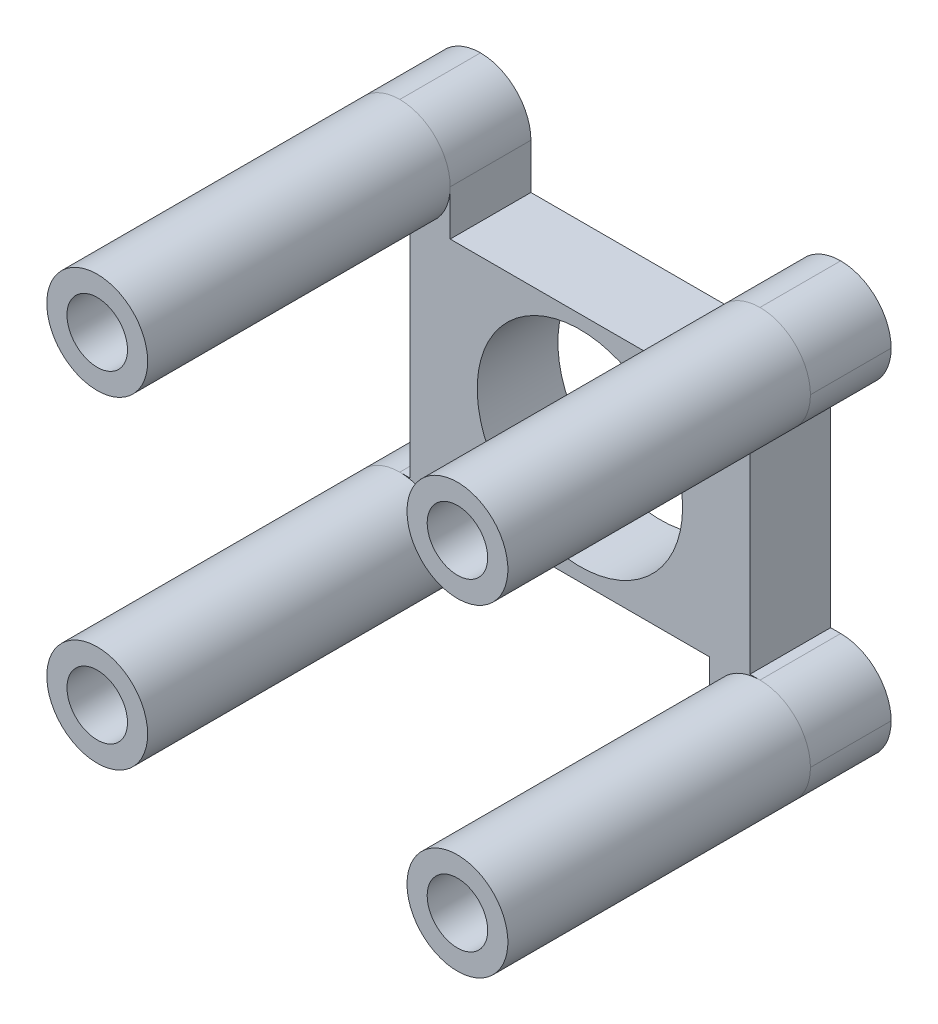
ISO-10303-21;
HEADER;
FILE_DESCRIPTION(('STEP AP214'),'2;1');
FILE_NAME('part.step','',(''),(''),'','','');
FILE_SCHEMA(('AUTOMOTIVE_DESIGN { 1 0 10303 214 1 1 1 1 }'));
ENDSEC;
DATA;
#1=APPLICATION_CONTEXT('core data for automotive mechanical design processes');
#2=APPLICATION_PROTOCOL_DEFINITION('international standard','automotive_design',2000,#1);
#3=PRODUCT_CONTEXT('',#1,'mechanical');
#4=PRODUCT('Part','Part','',(#3));
#5=PRODUCT_RELATED_PRODUCT_CATEGORY('part','',(#4));
#6=PRODUCT_DEFINITION_FORMATION('','',#4);
#7=PRODUCT_DEFINITION_CONTEXT('part definition',#1,'design');
#8=PRODUCT_DEFINITION('design','',#6,#7);
#9=PRODUCT_DEFINITION_SHAPE('','',#8);
#10=(LENGTH_UNIT() NAMED_UNIT(*) SI_UNIT(.MILLI.,.METRE.));
#11=(NAMED_UNIT(*) PLANE_ANGLE_UNIT() SI_UNIT($,.RADIAN.));
#12=(NAMED_UNIT(*) SI_UNIT($,.STERADIAN.) SOLID_ANGLE_UNIT());
#13=UNCERTAINTY_MEASURE_WITH_UNIT(LENGTH_MEASURE(1.E-05),#10,'distance_accuracy_value','');
#14=(GEOMETRIC_REPRESENTATION_CONTEXT(3) GLOBAL_UNCERTAINTY_ASSIGNED_CONTEXT((#13)) GLOBAL_UNIT_ASSIGNED_CONTEXT((#10,
#11,#12)) REPRESENTATION_CONTEXT('',''));
#15=CARTESIAN_POINT('',(0.,0.,0.));
#16=DIRECTION('',(0.,0.,1.));
#17=DIRECTION('',(1.,0.,0.));
#18=AXIS2_PLACEMENT_3D('',#15,#16,#17);
#19=CARTESIAN_POINT('',(0.,0.,4.));
#20=DIRECTION('',(0.,0.,1.));
#21=DIRECTION('',(1.,0.,0.));
#22=AXIS2_PLACEMENT_3D('',#19,#20,#21);
#23=PLANE('',#22);
#24=CARTESIAN_POINT('',(0.,0.,4.));
#25=DIRECTION('',(0.,0.,1.));
#26=DIRECTION('',(1.,0.,0.));
#27=AXIS2_PLACEMENT_3D('',#24,#25,#26);
#28=CIRCLE('',#27,5.09089278078686);
#29=CARTESIAN_POINT('',(5.09089278078686,0.,4.));
#30=VERTEX_POINT('',#29);
#31=EDGE_CURVE('E302',#30,#30,#28,.T.);
#32=ORIENTED_EDGE('',*,*,#31,.F.);
#33=EDGE_LOOP('',(#32));
#34=FACE_BOUND('',#33,.T.);
#35=CARTESIAN_POINT('',(8.92857817851206,-8.,4.));
#36=DIRECTION('',(0.,0.,1.));
#37=DIRECTION('',(1.,0.,0.));
#38=AXIS2_PLACEMENT_3D('',#35,#36,#37);
#39=CIRCLE('',#38,2.5);
#40=CARTESIAN_POINT('',(6.42857817851206,-8.,4.));
#41=VERTEX_POINT('',#40);
#42=CARTESIAN_POINT('',(8.92857817851206,-5.5,4.));
#43=VERTEX_POINT('',#42);
#44=EDGE_CURVE('E339',#41,#43,#39,.F.);
#45=ORIENTED_EDGE('',*,*,#44,.T.);
#46=DIRECTION('',(-1.,0.,0.));
#47=VECTOR('',#46,1.);
#48=CARTESIAN_POINT('',(11.4285781785121,-5.5,4.));
#49=LINE('',#48,#47);
#50=CARTESIAN_POINT('',(8.42857817851206,-5.5,4.));
#51=VERTEX_POINT('',#50);
#52=EDGE_CURVE('E218',#43,#51,#49,.T.);
#53=ORIENTED_EDGE('',*,*,#52,.T.);
#54=DIRECTION('',(0.,1.,0.));
#55=VECTOR('',#54,1.);
#56=CARTESIAN_POINT('',(8.42857817851206,5.5,4.));
#57=LINE('',#56,#55);
#58=CARTESIAN_POINT('',(8.42857817851206,5.5,4.));
#59=VERTEX_POINT('',#58);
#60=EDGE_CURVE('E206',#51,#59,#57,.T.);
#61=ORIENTED_EDGE('',*,*,#60,.T.);
#62=DIRECTION('',(1.,0.,0.));
#63=VECTOR('',#62,1.);
#64=CARTESIAN_POINT('',(11.4285781785121,5.5,4.));
#65=LINE('',#64,#63);
#66=CARTESIAN_POINT('',(8.92857817851206,5.5,4.));
#67=VERTEX_POINT('',#66);
#68=EDGE_CURVE('E199',#59,#67,#65,.T.);
#69=ORIENTED_EDGE('',*,*,#68,.T.);
#70=CARTESIAN_POINT('',(8.92857817851206,8.,4.));
#71=DIRECTION('',(0.,0.,1.));
#72=DIRECTION('',(1.,0.,0.));
#73=AXIS2_PLACEMENT_3D('',#70,#71,#72);
#74=CIRCLE('',#73,2.5);
#75=CARTESIAN_POINT('',(6.42857817851205,8.,4.));
#76=VERTEX_POINT('',#75);
#77=EDGE_CURVE('E330',#76,#67,#74,.T.);
#78=ORIENTED_EDGE('',*,*,#77,.F.);
#79=DIRECTION('',(0.,-1.,0.));
#80=VECTOR('',#79,1.);
#81=CARTESIAN_POINT('',(6.42857817851205,0.,4.));
#82=LINE('',#81,#80);
#83=CARTESIAN_POINT('',(6.42857817851205,5.75536104650486,4.));
#84=VERTEX_POINT('',#83);
#85=EDGE_CURVE('E298',#76,#84,#82,.T.);
#86=ORIENTED_EDGE('',*,*,#85,.T.);
#87=DIRECTION('',(1.,0.,0.));
#88=VECTOR('',#87,1.);
#89=CARTESIAN_POINT('',(0.,5.75536104650486,4.));
#90=LINE('',#89,#88);
#91=CARTESIAN_POINT('',(-6.42857817851206,5.75536104650486,4.));
#92=VERTEX_POINT('',#91);
#93=EDGE_CURVE('E299',#92,#84,#90,.T.);
#94=ORIENTED_EDGE('',*,*,#93,.F.);
#95=DIRECTION('',(0.,-1.,0.));
#96=VECTOR('',#95,1.);
#97=CARTESIAN_POINT('',(-6.42857817851206,0.,4.));
#98=LINE('',#97,#96);
#99=CARTESIAN_POINT('',(-6.42857817851206,8.,4.));
#100=VERTEX_POINT('',#99);
#101=EDGE_CURVE('E293',#100,#92,#98,.T.);
#102=ORIENTED_EDGE('',*,*,#101,.F.);
#103=CARTESIAN_POINT('',(-8.92857817851206,8.,4.));
#104=DIRECTION('',(0.,0.,1.));
#105=DIRECTION('',(1.,0.,0.));
#106=AXIS2_PLACEMENT_3D('',#103,#104,#105);
#107=CIRCLE('',#106,2.5);
#108=CARTESIAN_POINT('',(-8.92857817851206,5.5,4.));
#109=VERTEX_POINT('',#108);
#110=EDGE_CURVE('E287',#109,#100,#107,.T.);
#111=ORIENTED_EDGE('',*,*,#110,.F.);
#112=DIRECTION('',(-1.,0.,0.));
#113=VECTOR('',#112,1.);
#114=CARTESIAN_POINT('',(-11.4285781785121,5.5,4.));
#115=LINE('',#114,#113);
#116=CARTESIAN_POINT('',(-8.42857817851206,5.5,4.));
#117=VERTEX_POINT('',#116);
#118=EDGE_CURVE('E231',#117,#109,#115,.T.);
#119=ORIENTED_EDGE('',*,*,#118,.F.);
#120=DIRECTION('',(0.,1.,0.));
#121=VECTOR('',#120,1.);
#122=CARTESIAN_POINT('',(-8.42857817851206,5.5,4.));
#123=LINE('',#122,#121);
#124=CARTESIAN_POINT('',(-8.42857817851206,-5.5,4.));
#125=VERTEX_POINT('',#124);
#126=EDGE_CURVE('E228',#125,#117,#123,.T.);
#127=ORIENTED_EDGE('',*,*,#126,.F.);
#128=DIRECTION('',(1.,0.,0.));
#129=VECTOR('',#128,1.);
#130=CARTESIAN_POINT('',(-11.4285781785121,-5.5,4.));
#131=LINE('',#130,#129);
#132=CARTESIAN_POINT('',(-8.92857817851206,-5.5,4.));
#133=VERTEX_POINT('',#132);
#134=EDGE_CURVE('E226',#133,#125,#131,.T.);
#135=ORIENTED_EDGE('',*,*,#134,.F.);
#136=CARTESIAN_POINT('',(-8.92857817851206,-8.,4.));
#137=DIRECTION('',(0.,0.,1.));
#138=DIRECTION('',(1.,0.,0.));
#139=AXIS2_PLACEMENT_3D('',#136,#137,#138);
#140=CIRCLE('',#139,2.5);
#141=CARTESIAN_POINT('',(-6.42857817851206,-8.,4.));
#142=VERTEX_POINT('',#141);
#143=EDGE_CURVE('E343',#142,#133,#140,.T.);
#144=ORIENTED_EDGE('',*,*,#143,.F.);
#145=CARTESIAN_POINT('',(-6.42857817851206,-5.75536104650486,4.));
#146=VERTEX_POINT('',#145);
#147=EDGE_CURVE('E289',#146,#142,#98,.T.);
#148=ORIENTED_EDGE('',*,*,#147,.F.);
#149=DIRECTION('',(1.,0.,0.));
#150=VECTOR('',#149,1.);
#151=CARTESIAN_POINT('',(0.,-5.75536104650486,4.));
#152=LINE('',#151,#150);
#153=CARTESIAN_POINT('',(6.42857817851205,-5.75536104650486,4.));
#154=VERTEX_POINT('',#153);
#155=EDGE_CURVE('E291',#146,#154,#152,.T.);
#156=ORIENTED_EDGE('',*,*,#155,.T.);
#157=EDGE_CURVE('E295',#154,#41,#82,.T.);
#158=ORIENTED_EDGE('',*,*,#157,.T.);
#159=EDGE_LOOP('',(#45,#53,#61,#69,#78,#86,#94,#102,#111,#119,#127,#135,#144,#148,#156,#158));
#160=FACE_BOUND('',#159,.T.);
#161=ADVANCED_FACE('F35',(#34,#160),#23,.T.);
#162=CARTESIAN_POINT('',(0.,0.,0.));
#163=DIRECTION('',(0.,0.,1.));
#164=DIRECTION('',(1.,0.,0.));
#165=AXIS2_PLACEMENT_3D('',#162,#163,#164);
#166=PLANE('',#165);
#167=CARTESIAN_POINT('',(0.,0.,0.));
#168=DIRECTION('',(0.,0.,1.));
#169=DIRECTION('',(1.,0.,0.));
#170=AXIS2_PLACEMENT_3D('',#167,#168,#169);
#171=CIRCLE('',#170,5.09089278078686);
#172=CARTESIAN_POINT('',(5.09089278078686,0.,0.));
#173=VERTEX_POINT('',#172);
#174=EDGE_CURVE('E292',#173,#173,#171,.T.);
#175=ORIENTED_EDGE('',*,*,#174,.T.);
#176=EDGE_LOOP('',(#175));
#177=FACE_BOUND('',#176,.T.);
#178=CARTESIAN_POINT('',(-8.92857817851206,-8.,0.));
#179=DIRECTION('',(0.,0.,1.));
#180=DIRECTION('',(1.,0.,0.));
#181=AXIS2_PLACEMENT_3D('',#178,#179,#180);
#182=CIRCLE('',#181,2.5);
#183=CARTESIAN_POINT('',(-8.92857817851206,-10.5,0.));
#184=VERTEX_POINT('',#183);
#185=CARTESIAN_POINT('',(-11.4285781785121,-8.,0.));
#186=VERTEX_POINT('',#185);
#187=EDGE_CURVE('E362',#184,#186,#182,.F.);
#188=ORIENTED_EDGE('',*,*,#187,.T.);
#189=CARTESIAN_POINT('',(-8.92857817851206,-8.,0.));
#190=DIRECTION('',(0.,0.,1.));
#191=DIRECTION('',(1.,0.,0.));
#192=AXIS2_PLACEMENT_3D('',#189,#190,#191);
#193=CIRCLE('',#192,2.5);
#194=CARTESIAN_POINT('',(-8.92857817851206,-5.5,0.));
#195=VERTEX_POINT('',#194);
#196=EDGE_CURVE('E406',#186,#195,#193,.F.);
#197=ORIENTED_EDGE('',*,*,#196,.T.);
#198=DIRECTION('',(-1.,0.,0.));
#199=VECTOR('',#198,1.);
#200=CARTESIAN_POINT('',(-11.4285781785121,-5.5,0.));
#201=LINE('',#200,#199);
#202=CARTESIAN_POINT('',(-8.42857817851206,-5.5,0.));
#203=VERTEX_POINT('',#202);
#204=EDGE_CURVE('E236',#203,#195,#201,.T.);
#205=ORIENTED_EDGE('',*,*,#204,.F.);
#206=DIRECTION('',(0.,-1.,0.));
#207=VECTOR('',#206,1.);
#208=CARTESIAN_POINT('',(-8.42857817851206,5.5,0.));
#209=LINE('',#208,#207);
#210=CARTESIAN_POINT('',(-8.42857817851206,5.5,0.));
#211=VERTEX_POINT('',#210);
#212=EDGE_CURVE('E222',#211,#203,#209,.T.);
#213=ORIENTED_EDGE('',*,*,#212,.F.);
#214=DIRECTION('',(1.,0.,0.));
#215=VECTOR('',#214,1.);
#216=CARTESIAN_POINT('',(-11.4285781785121,5.5,0.));
#217=LINE('',#216,#215);
#218=CARTESIAN_POINT('',(-8.92857817851206,5.5,0.));
#219=VERTEX_POINT('',#218);
#220=EDGE_CURVE('E224',#219,#211,#217,.T.);
#221=ORIENTED_EDGE('',*,*,#220,.F.);
#222=CARTESIAN_POINT('',(-8.92857817851206,8.,0.));
#223=DIRECTION('',(0.,0.,1.));
#224=DIRECTION('',(1.,0.,0.));
#225=AXIS2_PLACEMENT_3D('',#222,#223,#224);
#226=CIRCLE('',#225,2.5);
#227=CARTESIAN_POINT('',(-11.4285781785121,8.,0.));
#228=VERTEX_POINT('',#227);
#229=EDGE_CURVE('E398',#219,#228,#226,.F.);
#230=ORIENTED_EDGE('',*,*,#229,.T.);
#231=CARTESIAN_POINT('',(-8.92857817851206,8.,0.));
#232=DIRECTION('',(0.,0.,1.));
#233=DIRECTION('',(1.,0.,0.));
#234=AXIS2_PLACEMENT_3D('',#231,#232,#233);
#235=CIRCLE('',#234,2.5);
#236=CARTESIAN_POINT('',(-8.92857817851206,10.5,0.));
#237=VERTEX_POINT('',#236);
#238=EDGE_CURVE('E346',#228,#237,#235,.F.);
#239=ORIENTED_EDGE('',*,*,#238,.T.);
#240=CARTESIAN_POINT('',(-8.92857817851206,8.,0.));
#241=DIRECTION('',(0.,0.,1.));
#242=DIRECTION('',(1.,0.,0.));
#243=AXIS2_PLACEMENT_3D('',#240,#241,#242);
#244=CIRCLE('',#243,2.5);
#245=CARTESIAN_POINT('',(-6.42857817851206,8.,0.));
#246=VERTEX_POINT('',#245);
#247=EDGE_CURVE('E350',#237,#246,#244,.F.);
#248=ORIENTED_EDGE('',*,*,#247,.T.);
#249=DIRECTION('',(0.,-1.,0.));
#250=VECTOR('',#249,1.);
#251=CARTESIAN_POINT('',(-6.42857817851206,0.,0.));
#252=LINE('',#251,#250);
#253=CARTESIAN_POINT('',(-6.42857817851206,5.75536104650486,0.));
#254=VERTEX_POINT('',#253);
#255=EDGE_CURVE('E309',#246,#254,#252,.T.);
#256=ORIENTED_EDGE('',*,*,#255,.T.);
#257=DIRECTION('',(1.,0.,0.));
#258=VECTOR('',#257,1.);
#259=CARTESIAN_POINT('',(0.,5.75536104650486,0.));
#260=LINE('',#259,#258);
#261=CARTESIAN_POINT('',(6.42857817851205,5.75536104650486,0.));
#262=VERTEX_POINT('',#261);
#263=EDGE_CURVE('E315',#254,#262,#260,.T.);
#264=ORIENTED_EDGE('',*,*,#263,.T.);
#265=DIRECTION('',(0.,-1.,0.));
#266=VECTOR('',#265,1.);
#267=CARTESIAN_POINT('',(6.42857817851205,0.,0.));
#268=LINE('',#267,#266);
#269=CARTESIAN_POINT('',(6.42857817851205,8.,0.));
#270=VERTEX_POINT('',#269);
#271=EDGE_CURVE('E314',#270,#262,#268,.T.);
#272=ORIENTED_EDGE('',*,*,#271,.F.);
#273=CARTESIAN_POINT('',(8.92857817851205,8.,0.));
#274=DIRECTION('',(0.,0.,1.));
#275=DIRECTION('',(1.,0.,0.));
#276=AXIS2_PLACEMENT_3D('',#273,#274,#275);
#277=CIRCLE('',#276,2.5);
#278=CARTESIAN_POINT('',(8.92857817851205,10.5,0.));
#279=VERTEX_POINT('',#278);
#280=EDGE_CURVE('E352',#270,#279,#277,.F.);
#281=ORIENTED_EDGE('',*,*,#280,.T.);
#282=CARTESIAN_POINT('',(8.92857817851205,8.,0.));
#283=DIRECTION('',(0.,0.,1.));
#284=DIRECTION('',(1.,0.,0.));
#285=AXIS2_PLACEMENT_3D('',#282,#283,#284);
#286=CIRCLE('',#285,2.5);
#287=CARTESIAN_POINT('',(11.4285781785121,8.,0.));
#288=VERTEX_POINT('',#287);
#289=EDGE_CURVE('E354',#279,#288,#286,.F.);
#290=ORIENTED_EDGE('',*,*,#289,.T.);
#291=CARTESIAN_POINT('',(8.92857817851205,8.,0.));
#292=DIRECTION('',(0.,0.,1.));
#293=DIRECTION('',(1.,0.,0.));
#294=AXIS2_PLACEMENT_3D('',#291,#292,#293);
#295=CIRCLE('',#294,2.5);
#296=CARTESIAN_POINT('',(8.92857817851205,5.5,0.));
#297=VERTEX_POINT('',#296);
#298=EDGE_CURVE('E50',#288,#297,#295,.F.);
#299=ORIENTED_EDGE('',*,*,#298,.T.);
#300=DIRECTION('',(-1.,0.,0.));
#301=VECTOR('',#300,1.);
#302=CARTESIAN_POINT('',(11.4285781785121,5.5,0.));
#303=LINE('',#302,#301);
#304=CARTESIAN_POINT('',(8.42857817851206,5.5,0.));
#305=VERTEX_POINT('',#304);
#306=EDGE_CURVE('E208',#297,#305,#303,.T.);
#307=ORIENTED_EDGE('',*,*,#306,.T.);
#308=DIRECTION('',(0.,-1.,0.));
#309=VECTOR('',#308,1.);
#310=CARTESIAN_POINT('',(8.42857817851206,5.5,0.));
#311=LINE('',#310,#309);
#312=CARTESIAN_POINT('',(8.42857817851206,-5.5,0.));
#313=VERTEX_POINT('',#312);
#314=EDGE_CURVE('E200',#305,#313,#311,.T.);
#315=ORIENTED_EDGE('',*,*,#314,.T.);
#316=DIRECTION('',(1.,0.,0.));
#317=VECTOR('',#316,1.);
#318=CARTESIAN_POINT('',(11.4285781785121,-5.5,0.));
#319=LINE('',#318,#317);
#320=CARTESIAN_POINT('',(8.92857817851206,-5.5,0.));
#321=VERTEX_POINT('',#320);
#322=EDGE_CURVE('E192',#313,#321,#319,.T.);
#323=ORIENTED_EDGE('',*,*,#322,.T.);
#324=CARTESIAN_POINT('',(8.92857817851206,-8.,0.));
#325=DIRECTION('',(0.,0.,1.));
#326=DIRECTION('',(1.,0.,0.));
#327=AXIS2_PLACEMENT_3D('',#324,#325,#326);
#328=CIRCLE('',#327,2.5);
#329=CARTESIAN_POINT('',(11.4285781785121,-8.,0.));
#330=VERTEX_POINT('',#329);
#331=EDGE_CURVE('E404',#321,#330,#328,.F.);
#332=ORIENTED_EDGE('',*,*,#331,.T.);
#333=CARTESIAN_POINT('',(8.92857817851206,-8.,0.));
#334=DIRECTION('',(0.,0.,1.));
#335=DIRECTION('',(1.,0.,0.));
#336=AXIS2_PLACEMENT_3D('',#333,#334,#335);
#337=CIRCLE('',#336,2.5);
#338=CARTESIAN_POINT('',(8.92857817851206,-10.5,0.));
#339=VERTEX_POINT('',#338);
#340=EDGE_CURVE('E356',#330,#339,#337,.F.);
#341=ORIENTED_EDGE('',*,*,#340,.T.);
#342=CARTESIAN_POINT('',(8.92857817851205,-8.,0.));
#343=DIRECTION('',(0.,0.,1.));
#344=DIRECTION('',(1.,0.,0.));
#345=AXIS2_PLACEMENT_3D('',#342,#343,#344);
#346=CIRCLE('',#345,2.5);
#347=CARTESIAN_POINT('',(6.42857817851205,-8.,0.));
#348=VERTEX_POINT('',#347);
#349=EDGE_CURVE('E358',#339,#348,#346,.F.);
#350=ORIENTED_EDGE('',*,*,#349,.T.);
#351=CARTESIAN_POINT('',(6.42857817851205,-5.75536104650486,0.));
#352=VERTEX_POINT('',#351);
#353=EDGE_CURVE('E311',#352,#348,#268,.T.);
#354=ORIENTED_EDGE('',*,*,#353,.F.);
#355=DIRECTION('',(1.,0.,0.));
#356=VECTOR('',#355,1.);
#357=CARTESIAN_POINT('',(0.,-5.75536104650486,0.));
#358=LINE('',#357,#356);
#359=CARTESIAN_POINT('',(-6.42857817851206,-5.75536104650486,0.));
#360=VERTEX_POINT('',#359);
#361=EDGE_CURVE('E308',#360,#352,#358,.T.);
#362=ORIENTED_EDGE('',*,*,#361,.F.);
#363=CARTESIAN_POINT('',(-6.42857817851206,-8.,0.));
#364=VERTEX_POINT('',#363);
#365=EDGE_CURVE('E285',#360,#364,#252,.T.);
#366=ORIENTED_EDGE('',*,*,#365,.T.);
#367=CARTESIAN_POINT('',(-8.92857817851206,-8.,0.));
#368=DIRECTION('',(0.,0.,1.));
#369=DIRECTION('',(1.,0.,0.));
#370=AXIS2_PLACEMENT_3D('',#367,#368,#369);
#371=CIRCLE('',#370,2.5);
#372=EDGE_CURVE('E360',#364,#184,#371,.F.);
#373=ORIENTED_EDGE('',*,*,#372,.T.);
#374=EDGE_LOOP('',(#188,#197,#205,#213,#221,#230,#239,#248,#256,#264,#272,#281,#290,#299,#307,
#315,#323,#332,#341,#350,#354,#362,#366,#373));
#375=FACE_BOUND('',#374,.T.);
#376=ADVANCED_FACE('F211',(#177,#375),#166,.F.);
#377=CARTESIAN_POINT('',(-6.42857817851206,0.,4.));
#378=DIRECTION('',(1.,0.,0.));
#379=DIRECTION('',(0.,0.,-1.));
#380=AXIS2_PLACEMENT_3D('',#377,#378,#379);
#381=PLANE('',#380);
#382=ORIENTED_EDGE('',*,*,#147,.T.);
#383=DIRECTION('',(0.,0.,-1.));
#384=VECTOR('',#383,1.);
#385=CARTESIAN_POINT('',(-6.42857817851206,-8.,4.));
#386=LINE('',#385,#384);
#387=EDGE_CURVE('E370',#142,#364,#386,.T.);
#388=ORIENTED_EDGE('',*,*,#387,.T.);
#389=ORIENTED_EDGE('',*,*,#365,.F.);
#390=DIRECTION('',(0.,0.,-1.));
#391=VECTOR('',#390,1.);
#392=CARTESIAN_POINT('',(-6.42857817851206,-5.75536104650486,4.));
#393=LINE('',#392,#391);
#394=EDGE_CURVE('E328',#146,#360,#393,.T.);
#395=ORIENTED_EDGE('',*,*,#394,.F.);
#396=EDGE_LOOP('',(#382,#388,#389,#395));
#397=FACE_BOUND('',#396,.T.);
#398=ADVANCED_FACE('F466',(#397),#381,.T.);
#399=CARTESIAN_POINT('',(0.,-5.75536104650486,4.));
#400=DIRECTION('',(0.,1.,0.));
#401=DIRECTION('',(0.,0.,1.));
#402=AXIS2_PLACEMENT_3D('',#399,#400,#401);
#403=PLANE('',#402);
#404=ORIENTED_EDGE('',*,*,#361,.T.);
#405=DIRECTION('',(0.,0.,-1.));
#406=VECTOR('',#405,1.);
#407=CARTESIAN_POINT('',(6.42857817851205,-5.75536104650486,4.));
#408=LINE('',#407,#406);
#409=EDGE_CURVE('E325',#154,#352,#408,.T.);
#410=ORIENTED_EDGE('',*,*,#409,.F.);
#411=ORIENTED_EDGE('',*,*,#155,.F.);
#412=ORIENTED_EDGE('',*,*,#394,.T.);
#413=EDGE_LOOP('',(#404,#410,#411,#412));
#414=FACE_BOUND('',#413,.T.);
#415=ADVANCED_FACE('F586',(#414),#403,.F.);
#416=CARTESIAN_POINT('',(6.42857817851205,0.,4.));
#417=DIRECTION('',(1.,0.,0.));
#418=DIRECTION('',(0.,0.,-1.));
#419=AXIS2_PLACEMENT_3D('',#416,#417,#418);
#420=PLANE('',#419);
#421=ORIENTED_EDGE('',*,*,#353,.T.);
#422=DIRECTION('',(0.,0.,-1.));
#423=VECTOR('',#422,1.);
#424=CARTESIAN_POINT('',(6.42857817851205,-8.,4.));
#425=LINE('',#424,#423);
#426=EDGE_CURVE('E372',#348,#41,#425,.F.);
#427=ORIENTED_EDGE('',*,*,#426,.T.);
#428=ORIENTED_EDGE('',*,*,#157,.F.);
#429=ORIENTED_EDGE('',*,*,#409,.T.);
#430=EDGE_LOOP('',(#421,#427,#428,#429));
#431=FACE_BOUND('',#430,.T.);
#432=ADVANCED_FACE('F441',(#431),#420,.F.);
#433=ORIENTED_EDGE('',*,*,#85,.F.);
#434=DIRECTION('',(0.,0.,-1.));
#435=VECTOR('',#434,1.);
#436=CARTESIAN_POINT('',(6.42857817851205,8.,0.));
#437=LINE('',#436,#435);
#438=EDGE_CURVE('E381',#76,#270,#437,.T.);
#439=ORIENTED_EDGE('',*,*,#438,.T.);
#440=ORIENTED_EDGE('',*,*,#271,.T.);
#441=DIRECTION('',(0.,0.,-1.));
#442=VECTOR('',#441,1.);
#443=CARTESIAN_POINT('',(6.42857817851205,5.75536104650486,4.));
#444=LINE('',#443,#442);
#445=EDGE_CURVE('E322',#84,#262,#444,.T.);
#446=ORIENTED_EDGE('',*,*,#445,.F.);
#447=EDGE_LOOP('',(#433,#439,#440,#446));
#448=FACE_BOUND('',#447,.T.);
#449=ADVANCED_FACE('F602',(#448),#420,.F.);
#450=CARTESIAN_POINT('',(0.,5.75536104650486,4.));
#451=DIRECTION('',(0.,1.,0.));
#452=DIRECTION('',(0.,0.,1.));
#453=AXIS2_PLACEMENT_3D('',#450,#451,#452);
#454=PLANE('',#453);
#455=ORIENTED_EDGE('',*,*,#263,.F.);
#456=DIRECTION('',(0.,0.,-1.));
#457=VECTOR('',#456,1.);
#458=CARTESIAN_POINT('',(-6.42857817851206,5.75536104650486,4.));
#459=LINE('',#458,#457);
#460=EDGE_CURVE('E305',#92,#254,#459,.T.);
#461=ORIENTED_EDGE('',*,*,#460,.F.);
#462=ORIENTED_EDGE('',*,*,#93,.T.);
#463=ORIENTED_EDGE('',*,*,#445,.T.);
#464=EDGE_LOOP('',(#455,#461,#462,#463));
#465=FACE_BOUND('',#464,.T.);
#466=ADVANCED_FACE('F563',(#465),#454,.T.);
#467=ORIENTED_EDGE('',*,*,#255,.F.);
#468=DIRECTION('',(0.,0.,-1.));
#469=VECTOR('',#468,1.);
#470=CARTESIAN_POINT('',(-6.42857817851206,8.,4.));
#471=LINE('',#470,#469);
#472=EDGE_CURVE('E383',#246,#100,#471,.F.);
#473=ORIENTED_EDGE('',*,*,#472,.T.);
#474=ORIENTED_EDGE('',*,*,#101,.T.);
#475=ORIENTED_EDGE('',*,*,#460,.T.);
#476=EDGE_LOOP('',(#467,#473,#474,#475));
#477=FACE_BOUND('',#476,.T.);
#478=ADVANCED_FACE('F557',(#477),#381,.T.);
#479=CARTESIAN_POINT('',(0.,0.,4.));
#480=DIRECTION('',(0.,0.,-1.));
#481=DIRECTION('',(-1.,0.,0.));
#482=AXIS2_PLACEMENT_3D('',#479,#480,#481);
#483=CYLINDRICAL_SURFACE('',#482,5.09089278078686);
#484=ORIENTED_EDGE('',*,*,#31,.T.);
#485=EDGE_LOOP('',(#484));
#486=FACE_BOUND('',#485,.T.);
#487=ORIENTED_EDGE('',*,*,#174,.F.);
#488=EDGE_LOOP('',(#487));
#489=FACE_BOUND('',#488,.T.);
#490=ADVANCED_FACE('F532',(#486,#489),#483,.F.);
#491=CARTESIAN_POINT('',(-8.92857817851206,8.,19.));
#492=DIRECTION('',(0.,0.,1.));
#493=DIRECTION('',(1.,0.,0.));
#494=AXIS2_PLACEMENT_3D('',#491,#492,#493);
#495=PLANE('',#494);
#496=CARTESIAN_POINT('',(-8.92857817851206,8.,19.));
#497=DIRECTION('',(0.,0.,1.));
#498=DIRECTION('',(1.,0.,0.));
#499=AXIS2_PLACEMENT_3D('',#496,#497,#498);
#500=CIRCLE('',#499,2.5);
#501=CARTESIAN_POINT('',(-6.42857817851206,8.,19.));
#502=VERTEX_POINT('',#501);
#503=EDGE_CURVE('E282',#502,#502,#500,.T.);
#504=ORIENTED_EDGE('',*,*,#503,.T.);
#505=EDGE_LOOP('',(#504));
#506=FACE_BOUND('',#505,.T.);
#507=CARTESIAN_POINT('',(-8.92857817851206,8.,19.));
#508=DIRECTION('',(0.,0.,1.));
#509=DIRECTION('',(1.,0.,0.));
#510=AXIS2_PLACEMENT_3D('',#507,#508,#509);
#511=CIRCLE('',#510,1.5);
#512=CARTESIAN_POINT('',(-7.42857817851206,8.,19.));
#513=VERTEX_POINT('',#512);
#514=EDGE_CURVE('E276',#513,#513,#511,.T.);
#515=ORIENTED_EDGE('',*,*,#514,.F.);
#516=EDGE_LOOP('',(#515));
#517=FACE_BOUND('',#516,.T.);
#518=ADVANCED_FACE('F530',(#506,#517),#495,.T.);
#519=CARTESIAN_POINT('',(-8.92857817851206,8.,19.));
#520=DIRECTION('',(0.,0.,-1.));
#521=DIRECTION('',(-1.,0.,0.));
#522=AXIS2_PLACEMENT_3D('',#519,#520,#521);
#523=CYLINDRICAL_SURFACE('',#522,2.5);
#524=ORIENTED_EDGE('',*,*,#503,.F.);
#525=EDGE_LOOP('',(#524));
#526=FACE_BOUND('',#525,.T.);
#527=CARTESIAN_POINT('',(-8.92857817851206,10.5,4.));
#528=VERTEX_POINT('',#527);
#529=EDGE_CURVE('E279',#100,#528,#107,.T.);
#530=ORIENTED_EDGE('',*,*,#529,.T.);
#531=CARTESIAN_POINT('',(-11.4285781785121,8.,4.));
#532=VERTEX_POINT('',#531);
#533=EDGE_CURVE('E544',#528,#532,#107,.T.);
#534=ORIENTED_EDGE('',*,*,#533,.T.);
#535=EDGE_CURVE('E288',#532,#109,#107,.T.);
#536=ORIENTED_EDGE('',*,*,#535,.T.);
#537=ORIENTED_EDGE('',*,*,#110,.T.);
#538=EDGE_LOOP('',(#530,#534,#536,#537));
#539=FACE_BOUND('',#538,.T.);
#540=ADVANCED_FACE('F489',(#526,#539),#523,.T.);
#541=CARTESIAN_POINT('',(-8.92857817851206,8.,19.));
#542=DIRECTION('',(0.,0.,-1.));
#543=DIRECTION('',(-1.,0.,0.));
#544=AXIS2_PLACEMENT_3D('',#541,#542,#543);
#545=CYLINDRICAL_SURFACE('',#544,1.5);
#546=ORIENTED_EDGE('',*,*,#514,.T.);
#547=EDGE_LOOP('',(#546));
#548=FACE_BOUND('',#547,.T.);
#549=CARTESIAN_POINT('',(-8.92857817851206,8.,4.));
#550=DIRECTION('',(0.,0.,1.));
#551=DIRECTION('',(1.,0.,0.));
#552=AXIS2_PLACEMENT_3D('',#549,#550,#551);
#553=CIRCLE('',#552,1.5);
#554=CARTESIAN_POINT('',(-7.42857817851206,8.,4.));
#555=VERTEX_POINT('',#554);
#556=EDGE_CURVE('E273',#555,#555,#553,.T.);
#557=ORIENTED_EDGE('',*,*,#556,.F.);
#558=EDGE_LOOP('',(#557));
#559=FACE_BOUND('',#558,.T.);
#560=ADVANCED_FACE('F479',(#548,#559),#545,.F.);
#561=ORIENTED_EDGE('',*,*,#556,.T.);
#562=EDGE_LOOP('',(#561));
#563=FACE_BOUND('',#562,.T.);
#564=ADVANCED_FACE('F462',(#563),#23,.T.);
#565=CARTESIAN_POINT('',(8.92857817851206,8.,19.));
#566=DIRECTION('',(0.,0.,-1.));
#567=DIRECTION('',(-1.,0.,0.));
#568=AXIS2_PLACEMENT_3D('',#565,#566,#567);
#569=CYLINDRICAL_SURFACE('',#568,2.5);
#570=CARTESIAN_POINT('',(8.92857817851206,8.,19.));
#571=DIRECTION('',(0.,0.,-1.));
#572=DIRECTION('',(-1.,0.,0.));
#573=AXIS2_PLACEMENT_3D('',#570,#571,#572);
#574=CIRCLE('',#573,2.5);
#575=CARTESIAN_POINT('',(6.42857817851206,8.,19.));
#576=VERTEX_POINT('',#575);
#577=EDGE_CURVE('E270',#576,#576,#574,.T.);
#578=ORIENTED_EDGE('',*,*,#577,.T.);
#579=EDGE_LOOP('',(#578));
#580=FACE_BOUND('',#579,.T.);
#581=CARTESIAN_POINT('',(8.92857817851206,8.,4.));
#582=DIRECTION('',(0.,0.,-1.));
#583=DIRECTION('',(-1.,0.,0.));
#584=AXIS2_PLACEMENT_3D('',#581,#582,#583);
#585=CIRCLE('',#584,2.5);
#586=CARTESIAN_POINT('',(8.92857817851205,10.5,4.));
#587=VERTEX_POINT('',#586);
#588=EDGE_CURVE('E267',#76,#587,#585,.T.);
#589=ORIENTED_EDGE('',*,*,#588,.F.);
#590=ORIENTED_EDGE('',*,*,#77,.T.);
#591=CARTESIAN_POINT('',(11.4285781785121,8.,4.));
#592=VERTEX_POINT('',#591);
#593=EDGE_CURVE('E334',#67,#592,#74,.T.);
#594=ORIENTED_EDGE('',*,*,#593,.T.);
#595=EDGE_CURVE('E333',#592,#587,#74,.T.);
#596=ORIENTED_EDGE('',*,*,#595,.T.);
#597=EDGE_LOOP('',(#589,#590,#594,#596));
#598=FACE_BOUND('',#597,.T.);
#599=ADVANCED_FACE('F478',(#580,#598),#569,.T.);
#600=CARTESIAN_POINT('',(8.92857817851206,8.,19.));
#601=DIRECTION('',(0.,0.,1.));
#602=DIRECTION('',(-1.,0.,0.));
#603=AXIS2_PLACEMENT_3D('',#600,#601,#602);
#604=PLANE('',#603);
#605=CARTESIAN_POINT('',(8.92857817851206,8.,19.));
#606=DIRECTION('',(0.,0.,-1.));
#607=DIRECTION('',(-1.,0.,0.));
#608=AXIS2_PLACEMENT_3D('',#605,#606,#607);
#609=CIRCLE('',#608,1.5);
#610=CARTESIAN_POINT('',(7.42857817851206,8.,19.));
#611=VERTEX_POINT('',#610);
#612=EDGE_CURVE('E264',#611,#611,#609,.T.);
#613=ORIENTED_EDGE('',*,*,#612,.T.);
#614=EDGE_LOOP('',(#613));
#615=FACE_BOUND('',#614,.T.);
#616=ORIENTED_EDGE('',*,*,#577,.F.);
#617=EDGE_LOOP('',(#616));
#618=FACE_BOUND('',#617,.T.);
#619=ADVANCED_FACE('F486',(#615,#618),#604,.T.);
#620=CARTESIAN_POINT('',(8.92857817851206,8.,19.));
#621=DIRECTION('',(0.,0.,-1.));
#622=DIRECTION('',(-1.,0.,0.));
#623=AXIS2_PLACEMENT_3D('',#620,#621,#622);
#624=CYLINDRICAL_SURFACE('',#623,1.5);
#625=ORIENTED_EDGE('',*,*,#612,.F.);
#626=EDGE_LOOP('',(#625));
#627=FACE_BOUND('',#626,.T.);
#628=CARTESIAN_POINT('',(8.92857817851206,8.,4.));
#629=DIRECTION('',(0.,0.,-1.));
#630=DIRECTION('',(-1.,0.,0.));
#631=AXIS2_PLACEMENT_3D('',#628,#629,#630);
#632=CIRCLE('',#631,1.5);
#633=CARTESIAN_POINT('',(7.42857817851206,8.,4.));
#634=VERTEX_POINT('',#633);
#635=EDGE_CURVE('E262',#634,#634,#632,.T.);
#636=ORIENTED_EDGE('',*,*,#635,.T.);
#637=EDGE_LOOP('',(#636));
#638=FACE_BOUND('',#637,.T.);
#639=ADVANCED_FACE('F494',(#627,#638),#624,.F.);
#640=ORIENTED_EDGE('',*,*,#635,.F.);
#641=EDGE_LOOP('',(#640));
#642=FACE_BOUND('',#641,.T.);
#643=ADVANCED_FACE('F481',(#642),#23,.T.);
#644=CARTESIAN_POINT('',(8.92857817851206,-8.,19.));
#645=DIRECTION('',(0.,0.,1.));
#646=DIRECTION('',(-1.,0.,0.));
#647=AXIS2_PLACEMENT_3D('',#644,#645,#646);
#648=PLANE('',#647);
#649=CARTESIAN_POINT('',(8.92857817851206,-8.,19.));
#650=DIRECTION('',(0.,0.,1.));
#651=DIRECTION('',(-1.,0.,0.));
#652=AXIS2_PLACEMENT_3D('',#649,#650,#651);
#653=CIRCLE('',#652,2.5);
#654=CARTESIAN_POINT('',(6.42857817851206,-8.,19.));
#655=VERTEX_POINT('',#654);
#656=EDGE_CURVE('E259',#655,#655,#653,.T.);
#657=ORIENTED_EDGE('',*,*,#656,.T.);
#658=EDGE_LOOP('',(#657));
#659=FACE_BOUND('',#658,.T.);
#660=CARTESIAN_POINT('',(8.92857817851206,-8.,19.));
#661=DIRECTION('',(0.,0.,1.));
#662=DIRECTION('',(-1.,0.,0.));
#663=AXIS2_PLACEMENT_3D('',#660,#661,#662);
#664=CIRCLE('',#663,1.5);
#665=CARTESIAN_POINT('',(7.42857817851206,-8.,19.));
#666=VERTEX_POINT('',#665);
#667=EDGE_CURVE('E253',#666,#666,#664,.T.);
#668=ORIENTED_EDGE('',*,*,#667,.F.);
#669=EDGE_LOOP('',(#668));
#670=FACE_BOUND('',#669,.T.);
#671=ADVANCED_FACE('F493',(#659,#670),#648,.T.);
#672=CARTESIAN_POINT('',(8.92857817851206,-8.,19.));
#673=DIRECTION('',(0.,0.,-1.));
#674=DIRECTION('',(-1.,0.,0.));
#675=AXIS2_PLACEMENT_3D('',#672,#673,#674);
#676=CYLINDRICAL_SURFACE('',#675,2.5);
#677=ORIENTED_EDGE('',*,*,#656,.F.);
#678=EDGE_LOOP('',(#677));
#679=FACE_BOUND('',#678,.T.);
#680=CARTESIAN_POINT('',(8.92857817851206,-8.,4.));
#681=DIRECTION('',(0.,0.,1.));
#682=DIRECTION('',(-1.,0.,0.));
#683=AXIS2_PLACEMENT_3D('',#680,#681,#682);
#684=CIRCLE('',#683,2.5);
#685=CARTESIAN_POINT('',(8.92857817851206,-10.5,4.));
#686=VERTEX_POINT('',#685);
#687=EDGE_CURVE('E258',#41,#686,#684,.T.);
#688=ORIENTED_EDGE('',*,*,#687,.T.);
#689=CARTESIAN_POINT('',(11.4285781785121,-8.,4.));
#690=VERTEX_POINT('',#689);
#691=EDGE_CURVE('E342',#690,#686,#39,.F.);
#692=ORIENTED_EDGE('',*,*,#691,.F.);
#693=EDGE_CURVE('E338',#43,#690,#39,.F.);
#694=ORIENTED_EDGE('',*,*,#693,.F.);
#695=ORIENTED_EDGE('',*,*,#44,.F.);
#696=EDGE_LOOP('',(#688,#692,#694,#695));
#697=FACE_BOUND('',#696,.T.);
#698=ADVANCED_FACE('F432',(#679,#697),#676,.T.);
#699=CARTESIAN_POINT('',(8.92857817851206,-8.,19.));
#700=DIRECTION('',(0.,0.,-1.));
#701=DIRECTION('',(-1.,0.,0.));
#702=AXIS2_PLACEMENT_3D('',#699,#700,#701);
#703=CYLINDRICAL_SURFACE('',#702,1.5);
#704=ORIENTED_EDGE('',*,*,#667,.T.);
#705=EDGE_LOOP('',(#704));
#706=FACE_BOUND('',#705,.T.);
#707=CARTESIAN_POINT('',(8.92857817851206,-8.,4.));
#708=DIRECTION('',(0.,0.,1.));
#709=DIRECTION('',(1.,0.,0.));
#710=AXIS2_PLACEMENT_3D('',#707,#708,#709);
#711=CIRCLE('',#710,1.5);
#712=CARTESIAN_POINT('',(10.4285781785121,-8.,4.));
#713=VERTEX_POINT('',#712);
#714=EDGE_CURVE('E335',#713,#713,#711,.F.);
#715=ORIENTED_EDGE('',*,*,#714,.T.);
#716=EDGE_LOOP('',(#715));
#717=FACE_BOUND('',#716,.T.);
#718=ADVANCED_FACE('F507',(#706,#717),#703,.F.);
#719=ORIENTED_EDGE('',*,*,#714,.F.);
#720=EDGE_LOOP('',(#719));
#721=FACE_BOUND('',#720,.T.);
#722=ADVANCED_FACE('F476',(#721),#23,.T.);
#723=CARTESIAN_POINT('',(-8.92857817851206,-8.,19.));
#724=DIRECTION('',(0.,0.,-1.));
#725=DIRECTION('',(-1.,0.,0.));
#726=AXIS2_PLACEMENT_3D('',#723,#724,#725);
#727=CYLINDRICAL_SURFACE('',#726,2.5);
#728=CARTESIAN_POINT('',(-8.92857817851206,-8.,19.));
#729=DIRECTION('',(0.,0.,-1.));
#730=DIRECTION('',(1.,0.,0.));
#731=AXIS2_PLACEMENT_3D('',#728,#729,#730);
#732=CIRCLE('',#731,2.5);
#733=CARTESIAN_POINT('',(-6.42857817851206,-8.,19.));
#734=VERTEX_POINT('',#733);
#735=EDGE_CURVE('E250',#734,#734,#732,.T.);
#736=ORIENTED_EDGE('',*,*,#735,.T.);
#737=EDGE_LOOP('',(#736));
#738=FACE_BOUND('',#737,.T.);
#739=CARTESIAN_POINT('',(-8.92857817851206,-8.,4.));
#740=DIRECTION('',(0.,0.,-1.));
#741=DIRECTION('',(1.,0.,0.));
#742=AXIS2_PLACEMENT_3D('',#739,#740,#741);
#743=CIRCLE('',#742,2.5);
#744=CARTESIAN_POINT('',(-8.92857817851206,-10.5,4.));
#745=VERTEX_POINT('',#744);
#746=EDGE_CURVE('E245',#142,#745,#743,.T.);
#747=ORIENTED_EDGE('',*,*,#746,.F.);
#748=ORIENTED_EDGE('',*,*,#143,.T.);
#749=CARTESIAN_POINT('',(-11.4285781785121,-8.,4.));
#750=VERTEX_POINT('',#749);
#751=EDGE_CURVE('E347',#133,#750,#140,.T.);
#752=ORIENTED_EDGE('',*,*,#751,.T.);
#753=EDGE_CURVE('E348',#750,#745,#140,.T.);
#754=ORIENTED_EDGE('',*,*,#753,.T.);
#755=EDGE_LOOP('',(#747,#748,#752,#754));
#756=FACE_BOUND('',#755,.T.);
#757=ADVANCED_FACE('F506',(#738,#756),#727,.T.);
#758=CARTESIAN_POINT('',(-8.92857817851206,-8.,19.));
#759=DIRECTION('',(0.,0.,1.));
#760=DIRECTION('',(1.,0.,0.));
#761=AXIS2_PLACEMENT_3D('',#758,#759,#760);
#762=PLANE('',#761);
#763=CARTESIAN_POINT('',(-8.92857817851206,-8.,19.));
#764=DIRECTION('',(0.,0.,-1.));
#765=DIRECTION('',(1.,0.,0.));
#766=AXIS2_PLACEMENT_3D('',#763,#764,#765);
#767=CIRCLE('',#766,1.5);
#768=CARTESIAN_POINT('',(-7.42857817851206,-8.,19.));
#769=VERTEX_POINT('',#768);
#770=EDGE_CURVE('E242',#769,#769,#767,.T.);
#771=ORIENTED_EDGE('',*,*,#770,.T.);
#772=EDGE_LOOP('',(#771));
#773=FACE_BOUND('',#772,.T.);
#774=ORIENTED_EDGE('',*,*,#735,.F.);
#775=EDGE_LOOP('',(#774));
#776=FACE_BOUND('',#775,.T.);
#777=ADVANCED_FACE('F513',(#773,#776),#762,.T.);
#778=CARTESIAN_POINT('',(-8.92857817851206,-8.,19.));
#779=DIRECTION('',(0.,0.,-1.));
#780=DIRECTION('',(-1.,0.,0.));
#781=AXIS2_PLACEMENT_3D('',#778,#779,#780);
#782=CYLINDRICAL_SURFACE('',#781,1.5);
#783=ORIENTED_EDGE('',*,*,#770,.F.);
#784=EDGE_LOOP('',(#783));
#785=FACE_BOUND('',#784,.T.);
#786=CARTESIAN_POINT('',(-8.92857817851206,-8.,4.));
#787=DIRECTION('',(0.,0.,-1.));
#788=DIRECTION('',(1.,0.,0.));
#789=AXIS2_PLACEMENT_3D('',#786,#787,#788);
#790=CIRCLE('',#789,1.5);
#791=CARTESIAN_POINT('',(-7.42857817851206,-8.,4.));
#792=VERTEX_POINT('',#791);
#793=EDGE_CURVE('E246',#792,#792,#790,.T.);
#794=ORIENTED_EDGE('',*,*,#793,.T.);
#795=EDGE_LOOP('',(#794));
#796=FACE_BOUND('',#795,.T.);
#797=ADVANCED_FACE('F474',(#785,#796),#782,.F.);
#798=ORIENTED_EDGE('',*,*,#793,.F.);
#799=EDGE_LOOP('',(#798));
#800=FACE_BOUND('',#799,.T.);
#801=ADVANCED_FACE('F461',(#800),#23,.T.);
#802=CARTESIAN_POINT('',(-8.92857817851206,-8.,4.));
#803=DIRECTION('',(0.,0.,-1.));
#804=DIRECTION('',(-1.,0.,0.));
#805=AXIS2_PLACEMENT_3D('',#802,#803,#804);
#806=CYLINDRICAL_SURFACE('',#805,2.5);
#807=ORIENTED_EDGE('',*,*,#387,.F.);
#808=ORIENTED_EDGE('',*,*,#746,.T.);
#809=DIRECTION('',(0.,0.,-1.));
#810=VECTOR('',#809,1.);
#811=CARTESIAN_POINT('',(-8.92857817851206,-10.5,4.));
#812=LINE('',#811,#810);
#813=EDGE_CURVE('E249',#184,#745,#812,.F.);
#814=ORIENTED_EDGE('',*,*,#813,.F.);
#815=ORIENTED_EDGE('',*,*,#372,.F.);
#816=EDGE_LOOP('',(#807,#808,#814,#815));
#817=FACE_BOUND('',#816,.T.);
#818=ADVANCED_FACE('F473',(#817),#806,.T.);
#819=CARTESIAN_POINT('',(-8.92857817851206,-8.,4.));
#820=DIRECTION('',(0.,0.,1.));
#821=DIRECTION('',(1.,0.,0.));
#822=AXIS2_PLACEMENT_3D('',#819,#820,#821);
#823=CYLINDRICAL_SURFACE('',#822,2.5);
#824=ORIENTED_EDGE('',*,*,#753,.F.);
#825=DIRECTION('',(0.,0.,-1.));
#826=VECTOR('',#825,1.);
#827=CARTESIAN_POINT('',(-11.4285781785121,-8.,4.));
#828=LINE('',#827,#826);
#829=EDGE_CURVE('E367',#186,#750,#828,.F.);
#830=ORIENTED_EDGE('',*,*,#829,.F.);
#831=ORIENTED_EDGE('',*,*,#187,.F.);
#832=ORIENTED_EDGE('',*,*,#813,.T.);
#833=EDGE_LOOP('',(#824,#830,#831,#832));
#834=FACE_BOUND('',#833,.T.);
#835=ADVANCED_FACE('F455',(#834),#823,.T.);
#836=CARTESIAN_POINT('',(8.92857817851206,-8.,4.));
#837=DIRECTION('',(0.,0.,1.));
#838=DIRECTION('',(1.,0.,0.));
#839=AXIS2_PLACEMENT_3D('',#836,#837,#838);
#840=CYLINDRICAL_SURFACE('',#839,2.5);
#841=DIRECTION('',(0.,0.,-1.));
#842=VECTOR('',#841,1.);
#843=CARTESIAN_POINT('',(11.4285781785121,-8.,0.));
#844=LINE('',#843,#842);
#845=EDGE_CURVE('E378',#690,#330,#844,.T.);
#846=ORIENTED_EDGE('',*,*,#845,.F.);
#847=ORIENTED_EDGE('',*,*,#691,.T.);
#848=DIRECTION('',(0.,0.,-1.));
#849=VECTOR('',#848,1.);
#850=CARTESIAN_POINT('',(8.92857817851206,-10.5,4.));
#851=LINE('',#850,#849);
#852=EDGE_CURVE('E389',#339,#686,#851,.F.);
#853=ORIENTED_EDGE('',*,*,#852,.F.);
#854=ORIENTED_EDGE('',*,*,#340,.F.);
#855=EDGE_LOOP('',(#846,#847,#853,#854));
#856=FACE_BOUND('',#855,.T.);
#857=ADVANCED_FACE('F434',(#856),#840,.T.);
#858=CARTESIAN_POINT('',(8.92857817851205,-8.,4.));
#859=DIRECTION('',(0.,0.,-1.));
#860=DIRECTION('',(-1.,0.,0.));
#861=AXIS2_PLACEMENT_3D('',#858,#859,#860);
#862=CYLINDRICAL_SURFACE('',#861,2.5);
#863=ORIENTED_EDGE('',*,*,#687,.F.);
#864=ORIENTED_EDGE('',*,*,#426,.F.);
#865=ORIENTED_EDGE('',*,*,#349,.F.);
#866=ORIENTED_EDGE('',*,*,#852,.T.);
#867=EDGE_LOOP('',(#863,#864,#865,#866));
#868=FACE_BOUND('',#867,.T.);
#869=ADVANCED_FACE('F444',(#868),#862,.T.);
#870=CARTESIAN_POINT('',(8.92857817851205,8.,4.));
#871=DIRECTION('',(0.,0.,1.));
#872=DIRECTION('',(1.,0.,0.));
#873=AXIS2_PLACEMENT_3D('',#870,#871,#872);
#874=CYLINDRICAL_SURFACE('',#873,2.5);
#875=ORIENTED_EDGE('',*,*,#438,.F.);
#876=ORIENTED_EDGE('',*,*,#588,.T.);
#877=DIRECTION('',(0.,0.,-1.));
#878=VECTOR('',#877,1.);
#879=CARTESIAN_POINT('',(8.92857817851205,10.5,4.));
#880=LINE('',#879,#878);
#881=EDGE_CURVE('E392',#279,#587,#880,.F.);
#882=ORIENTED_EDGE('',*,*,#881,.F.);
#883=ORIENTED_EDGE('',*,*,#280,.F.);
#884=EDGE_LOOP('',(#875,#876,#882,#883));
#885=FACE_BOUND('',#884,.T.);
#886=ADVANCED_FACE('F446',(#885),#874,.T.);
#887=CARTESIAN_POINT('',(8.92857817851205,8.,4.));
#888=DIRECTION('',(0.,0.,-1.));
#889=DIRECTION('',(-1.,0.,0.));
#890=AXIS2_PLACEMENT_3D('',#887,#888,#889);
#891=CYLINDRICAL_SURFACE('',#890,2.5);
#892=ORIENTED_EDGE('',*,*,#595,.F.);
#893=DIRECTION('',(0.,0.,-1.));
#894=VECTOR('',#893,1.);
#895=CARTESIAN_POINT('',(11.4285781785121,8.,4.));
#896=LINE('',#895,#894);
#897=EDGE_CURVE('E375',#288,#592,#896,.F.);
#898=ORIENTED_EDGE('',*,*,#897,.F.);
#899=ORIENTED_EDGE('',*,*,#289,.F.);
#900=ORIENTED_EDGE('',*,*,#881,.T.);
#901=EDGE_LOOP('',(#892,#898,#899,#900));
#902=FACE_BOUND('',#901,.T.);
#903=ADVANCED_FACE('F452',(#902),#891,.T.);
#904=CARTESIAN_POINT('',(-8.92857817851206,8.,4.));
#905=DIRECTION('',(0.,0.,-1.));
#906=DIRECTION('',(-1.,0.,0.));
#907=AXIS2_PLACEMENT_3D('',#904,#905,#906);
#908=CYLINDRICAL_SURFACE('',#907,2.5);
#909=DIRECTION('',(0.,0.,-1.));
#910=VECTOR('',#909,1.);
#911=CARTESIAN_POINT('',(-11.4285781785121,8.,4.));
#912=LINE('',#911,#910);
#913=EDGE_CURVE('E364',#532,#228,#912,.T.);
#914=ORIENTED_EDGE('',*,*,#913,.F.);
#915=ORIENTED_EDGE('',*,*,#533,.F.);
#916=DIRECTION('',(0.,0.,-1.));
#917=VECTOR('',#916,1.);
#918=CARTESIAN_POINT('',(-8.92857817851206,10.5,4.));
#919=LINE('',#918,#917);
#920=EDGE_CURVE('E241',#237,#528,#919,.F.);
#921=ORIENTED_EDGE('',*,*,#920,.F.);
#922=ORIENTED_EDGE('',*,*,#238,.F.);
#923=EDGE_LOOP('',(#914,#915,#921,#922));
#924=FACE_BOUND('',#923,.T.);
#925=ADVANCED_FACE('F551',(#924),#908,.T.);
#926=CARTESIAN_POINT('',(-8.92857817851206,8.,4.));
#927=DIRECTION('',(0.,0.,1.));
#928=DIRECTION('',(1.,0.,0.));
#929=AXIS2_PLACEMENT_3D('',#926,#927,#928);
#930=CYLINDRICAL_SURFACE('',#929,2.5);
#931=ORIENTED_EDGE('',*,*,#529,.F.);
#932=ORIENTED_EDGE('',*,*,#472,.F.);
#933=ORIENTED_EDGE('',*,*,#247,.F.);
#934=ORIENTED_EDGE('',*,*,#920,.T.);
#935=EDGE_LOOP('',(#931,#932,#933,#934));
#936=FACE_BOUND('',#935,.T.);
#937=ADVANCED_FACE('F554',(#936),#930,.T.);
#938=CARTESIAN_POINT('',(-11.4285781785121,5.5,-0.00100000000000013));
#939=DIRECTION('',(0.,1.,0.));
#940=DIRECTION('',(0.,0.,1.));
#941=AXIS2_PLACEMENT_3D('',#938,#939,#940);
#942=PLANE('',#941);
#943=ORIENTED_EDGE('',*,*,#118,.T.);
#944=DIRECTION('',(0.,0.,1.));
#945=VECTOR('',#944,1.);
#946=CARTESIAN_POINT('',(-8.92857817851206,5.5,-0.00100000000000013));
#947=LINE('',#946,#945);
#948=EDGE_CURVE('E386',#109,#219,#947,.F.);
#949=ORIENTED_EDGE('',*,*,#948,.T.);
#950=ORIENTED_EDGE('',*,*,#220,.T.);
#951=DIRECTION('',(0.,0.,1.));
#952=VECTOR('',#951,1.);
#953=CARTESIAN_POINT('',(-8.42857817851206,5.5,-0.00100000000000013));
#954=LINE('',#953,#952);
#955=EDGE_CURVE('E234',#211,#117,#954,.T.);
#956=ORIENTED_EDGE('',*,*,#955,.T.);
#957=EDGE_LOOP('',(#943,#949,#950,#956));
#958=FACE_BOUND('',#957,.T.);
#959=ADVANCED_FACE('F755',(#958),#942,.F.);
#960=CARTESIAN_POINT('',(-8.42857817851206,5.5,-0.00100000000000013));
#961=DIRECTION('',(1.,0.,0.));
#962=DIRECTION('',(0.,0.,-1.));
#963=AXIS2_PLACEMENT_3D('',#960,#961,#962);
#964=PLANE('',#963);
#965=ORIENTED_EDGE('',*,*,#212,.T.);
#966=DIRECTION('',(0.,0.,1.));
#967=VECTOR('',#966,1.);
#968=CARTESIAN_POINT('',(-8.42857817851206,-5.5,-0.00100000000000013));
#969=LINE('',#968,#967);
#970=EDGE_CURVE('E233',#203,#125,#969,.T.);
#971=ORIENTED_EDGE('',*,*,#970,.T.);
#972=ORIENTED_EDGE('',*,*,#126,.T.);
#973=ORIENTED_EDGE('',*,*,#955,.F.);
#974=EDGE_LOOP('',(#965,#971,#972,#973));
#975=FACE_BOUND('',#974,.T.);
#976=ADVANCED_FACE('F764',(#975),#964,.F.);
#977=CARTESIAN_POINT('',(-11.4285781785121,-5.5,-0.00100000000000013));
#978=DIRECTION('',(0.,-1.,0.));
#979=DIRECTION('',(0.,0.,-1.));
#980=AXIS2_PLACEMENT_3D('',#977,#978,#979);
#981=PLANE('',#980);
#982=ORIENTED_EDGE('',*,*,#204,.T.);
#983=DIRECTION('',(0.,0.,1.));
#984=VECTOR('',#983,1.);
#985=CARTESIAN_POINT('',(-8.92857817851206,-5.5,-0.00100000000000013));
#986=LINE('',#985,#984);
#987=EDGE_CURVE('E400',#195,#133,#986,.T.);
#988=ORIENTED_EDGE('',*,*,#987,.T.);
#989=ORIENTED_EDGE('',*,*,#134,.T.);
#990=ORIENTED_EDGE('',*,*,#970,.F.);
#991=EDGE_LOOP('',(#982,#988,#989,#990));
#992=FACE_BOUND('',#991,.T.);
#993=ADVANCED_FACE('F416',(#992),#981,.F.);
#994=CARTESIAN_POINT('',(-8.92857817851206,8.,4.));
#995=DIRECTION('',(0.,0.,1.));
#996=DIRECTION('',(1.,0.,0.));
#997=AXIS2_PLACEMENT_3D('',#994,#995,#996);
#998=CYLINDRICAL_SURFACE('',#997,2.5);
#999=ORIENTED_EDGE('',*,*,#229,.F.);
#1000=ORIENTED_EDGE('',*,*,#948,.F.);
#1001=ORIENTED_EDGE('',*,*,#535,.F.);
#1002=ORIENTED_EDGE('',*,*,#913,.T.);
#1003=EDGE_LOOP('',(#999,#1000,#1001,#1002));
#1004=FACE_BOUND('',#1003,.T.);
#1005=ADVANCED_FACE('F792',(#1004),#998,.T.);
#1006=CARTESIAN_POINT('',(11.4285781785121,-5.5,-0.00100000000000013));
#1007=DIRECTION('',(0.,1.,0.));
#1008=DIRECTION('',(0.,0.,1.));
#1009=AXIS2_PLACEMENT_3D('',#1006,#1007,#1008);
#1010=PLANE('',#1009);
#1011=ORIENTED_EDGE('',*,*,#52,.F.);
#1012=DIRECTION('',(0.,0.,1.));
#1013=VECTOR('',#1012,1.);
#1014=CARTESIAN_POINT('',(8.92857817851206,-5.5,-0.00100000000000013));
#1015=LINE('',#1014,#1013);
#1016=EDGE_CURVE('E43',#43,#321,#1015,.F.);
#1017=ORIENTED_EDGE('',*,*,#1016,.T.);
#1018=ORIENTED_EDGE('',*,*,#322,.F.);
#1019=DIRECTION('',(0.,0.,1.));
#1020=VECTOR('',#1019,1.);
#1021=CARTESIAN_POINT('',(8.42857817851206,-5.5,-0.00100000000000013));
#1022=LINE('',#1021,#1020);
#1023=EDGE_CURVE('E195',#313,#51,#1022,.T.);
#1024=ORIENTED_EDGE('',*,*,#1023,.T.);
#1025=EDGE_LOOP('',(#1011,#1017,#1018,#1024));
#1026=FACE_BOUND('',#1025,.T.);
#1027=ADVANCED_FACE('F194',(#1026),#1010,.T.);
#1028=CARTESIAN_POINT('',(8.42857817851206,5.5,-0.00100000000000013));
#1029=DIRECTION('',(1.,0.,0.));
#1030=DIRECTION('',(0.,0.,-1.));
#1031=AXIS2_PLACEMENT_3D('',#1028,#1029,#1030);
#1032=PLANE('',#1031);
#1033=DIRECTION('',(0.,0.,1.));
#1034=VECTOR('',#1033,1.);
#1035=CARTESIAN_POINT('',(8.42857817851206,5.5,-0.00100000000000013));
#1036=LINE('',#1035,#1034);
#1037=EDGE_CURVE('E209',#305,#59,#1036,.T.);
#1038=ORIENTED_EDGE('',*,*,#1037,.T.);
#1039=ORIENTED_EDGE('',*,*,#60,.F.);
#1040=ORIENTED_EDGE('',*,*,#1023,.F.);
#1041=ORIENTED_EDGE('',*,*,#314,.F.);
#1042=EDGE_LOOP('',(#1038,#1039,#1040,#1041));
#1043=FACE_BOUND('',#1042,.T.);
#1044=ADVANCED_FACE('F204',(#1043),#1032,.T.);
#1045=CARTESIAN_POINT('',(11.4285781785121,5.5,-0.00100000000000013));
#1046=DIRECTION('',(0.,-1.,0.));
#1047=DIRECTION('',(0.,0.,-1.));
#1048=AXIS2_PLACEMENT_3D('',#1045,#1046,#1047);
#1049=PLANE('',#1048);
#1050=ORIENTED_EDGE('',*,*,#306,.F.);
#1051=DIRECTION('',(0.,0.,1.));
#1052=VECTOR('',#1051,1.);
#1053=CARTESIAN_POINT('',(8.92857817851205,5.5,-0.00100000000000013));
#1054=LINE('',#1053,#1052);
#1055=EDGE_CURVE('E11',#297,#67,#1054,.T.);
#1056=ORIENTED_EDGE('',*,*,#1055,.T.);
#1057=ORIENTED_EDGE('',*,*,#68,.F.);
#1058=ORIENTED_EDGE('',*,*,#1037,.F.);
#1059=EDGE_LOOP('',(#1050,#1056,#1057,#1058));
#1060=FACE_BOUND('',#1059,.T.);
#1061=ADVANCED_FACE('F579',(#1060),#1049,.T.);
#1062=CARTESIAN_POINT('',(-8.92857817851206,-8.,-0.00100000000000013));
#1063=DIRECTION('',(0.,0.,1.));
#1064=DIRECTION('',(1.,0.,0.));
#1065=AXIS2_PLACEMENT_3D('',#1062,#1063,#1064);
#1066=CYLINDRICAL_SURFACE('',#1065,2.5);
#1067=ORIENTED_EDGE('',*,*,#196,.F.);
#1068=ORIENTED_EDGE('',*,*,#829,.T.);
#1069=ORIENTED_EDGE('',*,*,#751,.F.);
#1070=ORIENTED_EDGE('',*,*,#987,.F.);
#1071=EDGE_LOOP('',(#1067,#1068,#1069,#1070));
#1072=FACE_BOUND('',#1071,.T.);
#1073=ADVANCED_FACE('F418',(#1072),#1066,.T.);
#1074=CARTESIAN_POINT('',(8.92857817851206,-8.,4.));
#1075=DIRECTION('',(0.,0.,1.));
#1076=DIRECTION('',(1.,0.,0.));
#1077=AXIS2_PLACEMENT_3D('',#1074,#1075,#1076);
#1078=CYLINDRICAL_SURFACE('',#1077,2.5);
#1079=ORIENTED_EDGE('',*,*,#331,.F.);
#1080=ORIENTED_EDGE('',*,*,#1016,.F.);
#1081=ORIENTED_EDGE('',*,*,#693,.T.);
#1082=ORIENTED_EDGE('',*,*,#845,.T.);
#1083=EDGE_LOOP('',(#1079,#1080,#1081,#1082));
#1084=FACE_BOUND('',#1083,.T.);
#1085=ADVANCED_FACE('F429',(#1084),#1078,.T.);
#1086=CARTESIAN_POINT('',(8.92857817851205,8.,-0.00100000000000013));
#1087=DIRECTION('',(0.,0.,1.));
#1088=DIRECTION('',(1.,0.,0.));
#1089=AXIS2_PLACEMENT_3D('',#1086,#1087,#1088);
#1090=CYLINDRICAL_SURFACE('',#1089,2.5);
#1091=ORIENTED_EDGE('',*,*,#298,.F.);
#1092=ORIENTED_EDGE('',*,*,#897,.T.);
#1093=ORIENTED_EDGE('',*,*,#593,.F.);
#1094=ORIENTED_EDGE('',*,*,#1055,.F.);
#1095=EDGE_LOOP('',(#1091,#1092,#1093,#1094));
#1096=FACE_BOUND('',#1095,.T.);
#1097=ADVANCED_FACE('F37',(#1096),#1090,.T.);
#1098=CLOSED_SHELL('',(#161,#376,#398,#415,#432,#449,#466,#478,#490,#518,#540,#560,#564,#599,
#619,#639,#643,#671,#698,#718,#722,#757,#777,#797,#801,#818,#835,#857,#869,#886,#903,#925,#937,
#959,#976,#993,#1005,#1027,#1044,#1061,#1073,#1085,#1097));
#1099=MANIFOLD_SOLID_BREP('B2',#1098);
#1100=ADVANCED_BREP_SHAPE_REPRESENTATION('',(#18,#1099),#14);
#1101=SHAPE_DEFINITION_REPRESENTATION(#9,#1100);
ENDSEC;
END-ISO-10303-21;
